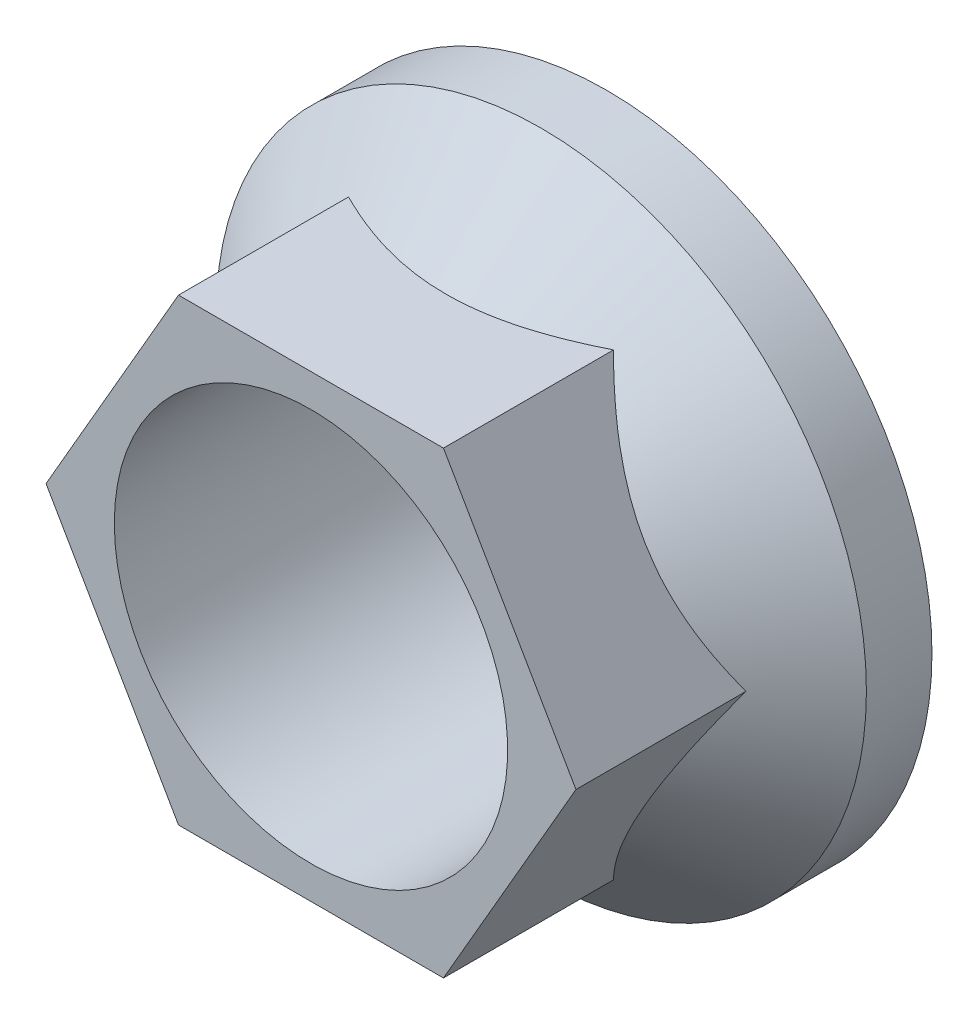
ISO-10303-21;
HEADER;
FILE_DESCRIPTION(('STEP AP214'),'2;1');
FILE_NAME('part.step','',(''),(''),'','','');
FILE_SCHEMA(('AUTOMOTIVE_DESIGN { 1 0 10303 214 1 1 1 1 }'));
ENDSEC;
DATA;
#1=APPLICATION_CONTEXT('core data for automotive mechanical design processes');
#2=APPLICATION_PROTOCOL_DEFINITION('international standard','automotive_design',2000,#1);
#3=PRODUCT_CONTEXT('',#1,'mechanical');
#4=PRODUCT('Part','Part','',(#3));
#5=PRODUCT_RELATED_PRODUCT_CATEGORY('part','',(#4));
#6=PRODUCT_DEFINITION_FORMATION('','',#4);
#7=PRODUCT_DEFINITION_CONTEXT('part definition',#1,'design');
#8=PRODUCT_DEFINITION('design','',#6,#7);
#9=PRODUCT_DEFINITION_SHAPE('','',#8);
#10=(LENGTH_UNIT() NAMED_UNIT(*) SI_UNIT(.MILLI.,.METRE.));
#11=(NAMED_UNIT(*) PLANE_ANGLE_UNIT() SI_UNIT($,.RADIAN.));
#12=(NAMED_UNIT(*) SI_UNIT($,.STERADIAN.) SOLID_ANGLE_UNIT());
#13=UNCERTAINTY_MEASURE_WITH_UNIT(LENGTH_MEASURE(1.E-05),#10,'distance_accuracy_value','');
#14=(GEOMETRIC_REPRESENTATION_CONTEXT(3) GLOBAL_UNCERTAINTY_ASSIGNED_CONTEXT((#13)) GLOBAL_UNIT_ASSIGNED_CONTEXT((#10,
#11,#12)) REPRESENTATION_CONTEXT('',''));
#15=CARTESIAN_POINT('',(0.,0.,0.));
#16=DIRECTION('',(0.,0.,1.));
#17=DIRECTION('',(1.,0.,0.));
#18=AXIS2_PLACEMENT_3D('',#15,#16,#17);
#19=CARTESIAN_POINT('',(0.,4.7625,7.1628));
#20=DIRECTION('',(0.,0.,1.));
#21=DIRECTION('',(1.,0.,0.));
#22=AXIS2_PLACEMENT_3D('',#19,#20,#21);
#23=PLANE('',#22);
#24=CARTESIAN_POINT('',(0.,0.,7.1628));
#25=DIRECTION('',(0.,0.,-1.));
#26=DIRECTION('',(-1.,0.,0.));
#27=AXIS2_PLACEMENT_3D('',#24,#25,#26);
#28=CIRCLE('',#27,4.7625);
#29=CARTESIAN_POINT('',(-4.7625,0.,7.1628));
#30=VERTEX_POINT('',#29);
#31=EDGE_CURVE('E114',#30,#30,#28,.T.);
#32=ORIENTED_EDGE('',*,*,#31,.T.);
#33=EDGE_LOOP('',(#32));
#34=FACE_BOUND('',#33,.T.);
#35=DIRECTION('',(-0.5,0.866025403784439,0.));
#36=VECTOR('',#35,1.);
#37=CARTESIAN_POINT('',(6.41580486636972,0.,7.1628));
#38=LINE('',#37,#36);
#39=CARTESIAN_POINT('',(6.41580486636972,0.,7.1628));
#40=VERTEX_POINT('',#39);
#41=CARTESIAN_POINT('',(3.20790243318486,5.55625,7.1628));
#42=VERTEX_POINT('',#41);
#43=EDGE_CURVE('E99',#40,#42,#38,.T.);
#44=ORIENTED_EDGE('',*,*,#43,.T.);
#45=DIRECTION('',(-1.,0.,0.));
#46=VECTOR('',#45,1.);
#47=CARTESIAN_POINT('',(3.20790243318486,5.55625,7.1628));
#48=LINE('',#47,#46);
#49=CARTESIAN_POINT('',(-3.20790243318486,5.55625,7.1628));
#50=VERTEX_POINT('',#49);
#51=EDGE_CURVE('E95',#42,#50,#48,.T.);
#52=ORIENTED_EDGE('',*,*,#51,.T.);
#53=DIRECTION('',(-0.5,-0.866025403784438,0.));
#54=VECTOR('',#53,1.);
#55=CARTESIAN_POINT('',(-3.20790243318486,5.55625,7.1628));
#56=LINE('',#55,#54);
#57=CARTESIAN_POINT('',(-6.41580486636972,0.,7.1628));
#58=VERTEX_POINT('',#57);
#59=EDGE_CURVE('E85',#50,#58,#56,.T.);
#60=ORIENTED_EDGE('',*,*,#59,.T.);
#61=DIRECTION('',(0.5,-0.866025403784439,0.));
#62=VECTOR('',#61,1.);
#63=CARTESIAN_POINT('',(-6.41580486636972,0.,7.1628));
#64=LINE('',#63,#62);
#65=CARTESIAN_POINT('',(-3.20790243318486,-5.55625,7.1628));
#66=VERTEX_POINT('',#65);
#67=EDGE_CURVE('E94',#58,#66,#64,.T.);
#68=ORIENTED_EDGE('',*,*,#67,.T.);
#69=DIRECTION('',(1.,0.,0.));
#70=VECTOR('',#69,1.);
#71=CARTESIAN_POINT('',(-3.20790243318486,-5.55625,7.1628));
#72=LINE('',#71,#70);
#73=CARTESIAN_POINT('',(3.20790243318486,-5.55625,7.1628));
#74=VERTEX_POINT('',#73);
#75=EDGE_CURVE('E216',#66,#74,#72,.T.);
#76=ORIENTED_EDGE('',*,*,#75,.T.);
#77=DIRECTION('',(0.5,0.866025403784438,0.));
#78=VECTOR('',#77,1.);
#79=CARTESIAN_POINT('',(3.20790243318486,-5.55625,7.1628));
#80=LINE('',#79,#78);
#81=EDGE_CURVE('E110',#74,#40,#80,.T.);
#82=ORIENTED_EDGE('',*,*,#81,.T.);
#83=EDGE_LOOP('',(#44,#52,#60,#68,#76,#82));
#84=FACE_BOUND('',#83,.T.);
#85=ADVANCED_FACE('F34',(#34,#84),#23,.T.);
#86=CARTESIAN_POINT('',(0.,0.,1.5875));
#87=DIRECTION('',(0.,0.,-1.));
#88=DIRECTION('',(-1.,0.,0.));
#89=AXIS2_PLACEMENT_3D('',#86,#87,#88);
#90=CONICAL_SURFACE('',#89,7.874,0.78539816339745);
#91=CARTESIAN_POINT('',(-6.41592033642356,-0.00019999999999813,3.04557966045919));
#92=CARTESIAN_POINT('',(-6.36076227325002,0.0953365678636634,3.1007324220348));
#93=CARTESIAN_POINT('',(-6.30518023730597,0.191607478106875,3.1541926394216));
#94=CARTESIAN_POINT('',(-6.19308504136997,0.385762052752419,3.25721311667275));
#95=CARTESIAN_POINT('',(-6.13657139292006,0.483646563188735,3.30677124652499));
#96=CARTESIAN_POINT('',(-5.96498322925127,0.780845980640526,3.44924281917032));
#97=CARTESIAN_POINT('',(-5.84845612865765,0.982676839327367,3.5353456466525));
#98=CARTESIAN_POINT('',(-5.61346990577191,1.38968491644418,3.68279085611817));
#99=CARTESIAN_POINT('',(-5.49507084527668,1.59475810479033,3.74450470595627));
#100=CARTESIAN_POINT('',(-5.31552571534156,1.90573939208951,3.81589250337743));
#101=CARTESIAN_POINT('',(-5.25541299798502,2.00985767273207,3.83614839260828));
#102=CARTESIAN_POINT('',(-5.13467857755459,2.21897582313996,3.86914080341459));
#103=CARTESIAN_POINT('',(-5.07405695192314,2.32397555877105,3.88187844876181));
#104=CARTESIAN_POINT('',(-4.92633097152755,2.57984446241415,3.90323487487138));
#105=CARTESIAN_POINT('',(-4.83906744920444,2.73098931672518,3.90771592717981));
#106=CARTESIAN_POINT('',(-4.66469767767716,3.03300662031461,3.90019519640634));
#107=CARTESIAN_POINT('',(-4.57759149431931,3.18387895554382,3.88818763540786));
#108=CARTESIAN_POINT('',(-4.40420034365476,3.48420123807766,3.84839747805151));
#109=CARTESIAN_POINT('',(-4.31791640464718,3.63364940431594,3.82059724001052));
#110=CARTESIAN_POINT('',(-4.14683153450048,3.92997709181637,3.75073312732753));
#111=CARTESIAN_POINT('',(-4.06203049017168,4.07685680912875,3.70867034639006));
#112=CARTESIAN_POINT('',(-3.91149236796599,4.337596485265,3.62213363508139));
#113=CARTESIAN_POINT('',(-3.84542197389367,4.45203376467436,3.57993545710749));
#114=CARTESIAN_POINT('',(-3.71446724591897,4.6788540070179,3.48873889719048));
#115=CARTESIAN_POINT('',(-3.64958294807509,4.79123690749694,3.43974030889598));
#116=CARTESIAN_POINT('',(-3.52120477373998,5.01359442802828,3.33604132435941));
#117=CARTESIAN_POINT('',(-3.45770724608012,5.12357537209016,3.28135885880867));
#118=CARTESIAN_POINT('',(-3.33188800845605,5.34150068422464,3.16701006386821));
#119=CARTESIAN_POINT('',(-3.26956560568257,5.44944625227808,3.10734679124864));
#120=CARTESIAN_POINT('',(-3.20778696313102,5.55645,3.04557966045919));
#121=B_SPLINE_CURVE_WITH_KNOTS('',3,(#91,#92,#93,#94,#95,#96,#97,#98,#99,#100,#101,#102,#103,
#104,#105,#106,#107,#108,#109,#110,#111,#112,#113,#114,#115,#116,#117,#118,#119,#120),
.UNSPECIFIED.,.F.,.F.,(4,2,2,2,2,2,2,2,2,2,2,2,2,2,4),(0.,0.369982774103464,0.740166128456626,
1.48452951278213,2.21707291656614,2.58262618134806,2.94812479207227,3.47106468924808,
3.99418788105352,4.51789659566178,5.04156515942817,5.45751515378559,5.8734777724733,
6.28816585755633,6.70260128950947),.UNSPECIFIED.);
#122=CARTESIAN_POINT('',(-6.41580486636972,0.,3.04569513363028));
#123=VERTEX_POINT('',#122);
#124=CARTESIAN_POINT('',(-3.20790243318486,5.55625,3.04569513363028));
#125=VERTEX_POINT('',#124);
#126=EDGE_CURVE('E48',#123,#125,#121,.T.);
#127=ORIENTED_EDGE('',*,*,#126,.T.);
#128=CARTESIAN_POINT('',(-7.35024143807917,5.55625,0.247490923568824));
#129=CARTESIAN_POINT('',(-7.17477848249057,5.55625,0.387431646679454));
#130=CARTESIAN_POINT('',(-6.99844802511035,5.55625,0.526300519665365));
#131=CARTESIAN_POINT('',(-6.6436721673341,5.55625,0.80138477713585));
#132=CARTESIAN_POINT('',(-6.46522633144373,5.55625,0.937599599416392));
#133=CARTESIAN_POINT('',(-6.10455267541776,5.55625,1.2078260776591));
#134=CARTESIAN_POINT('',(-5.92230644932557,5.55625,1.34181324135698));
#135=CARTESIAN_POINT('',(-5.55492580362585,5.55625,1.60575197786215));
#136=CARTESIAN_POINT('',(-5.3697915775665,5.55625,1.73570381937817));
#137=CARTESIAN_POINT('',(-4.98184197050416,5.55625,2.00033263124969));
#138=CARTESIAN_POINT('',(-4.77875522479701,5.55625,2.13461371344198));
#139=CARTESIAN_POINT('',(-4.36779815551963,5.55625,2.39578072044687));
#140=CARTESIAN_POINT('',(-4.15992694071703,5.55625,2.52266525165115));
#141=CARTESIAN_POINT('',(-3.73918743996258,5.55625,2.76641880126752));
#142=CARTESIAN_POINT('',(-3.52633612498972,5.55625,2.88331688555397));
#143=CARTESIAN_POINT('',(-3.09422026463497,5.55625,3.10448218285466));
#144=CARTESIAN_POINT('',(-2.87495904710191,5.55625,3.20875581048902));
#145=CARTESIAN_POINT('',(-2.45872772981492,5.55625,3.38804642128809));
#146=CARTESIAN_POINT('',(-2.26264764911937,5.55625,3.46510898935291));
#147=CARTESIAN_POINT('',(-1.86493159867599,5.55625,3.60358518307688));
#148=CARTESIAN_POINT('',(-1.66329527695573,5.55625,3.66499781481904));
#149=CARTESIAN_POINT('',(-1.25902765194999,5.55625,3.76767534758106));
#150=CARTESIAN_POINT('',(-1.05649142096246,5.55625,3.80930776313862));
#151=CARTESIAN_POINT('',(-0.648160484827875,5.55625,3.87120610965471));
#152=CARTESIAN_POINT('',(-0.442366778371329,5.55625,3.89147846524773));
#153=CARTESIAN_POINT('',(-0.0419810989880809,5.55625,3.9084777691822));
#154=CARTESIAN_POINT('',(0.152554650536229,5.55625,3.90652455263151));
#155=CARTESIAN_POINT('',(0.540351620644994,5.55625,3.88239374529604));
#156=CARTESIAN_POINT('',(0.733612786699872,5.55625,3.86021529481098));
#157=CARTESIAN_POINT('',(1.11857062434674,5.55625,3.79698528703855));
#158=CARTESIAN_POINT('',(1.31024187965122,5.55625,3.75578206043775));
#159=CARTESIAN_POINT('',(1.68928892475082,5.55625,3.65701197831449));
#160=CARTESIAN_POINT('',(1.87666380806737,5.55625,3.59944170327131));
#161=CARTESIAN_POINT('',(2.2415409471002,5.55625,3.47251424021206));
#162=CARTESIAN_POINT('',(2.41917299484202,5.55625,3.40352483236507));
#163=CARTESIAN_POINT('',(2.77004142749089,5.55625,3.25507128648969));
#164=CARTESIAN_POINT('',(2.94327608271936,5.55625,3.17560310058288));
#165=CARTESIAN_POINT('',(3.28583211937289,5.55625,3.00810943147436));
#166=CARTESIAN_POINT('',(3.45514753273432,5.55625,2.92007184015136));
#167=CARTESIAN_POINT('',(3.79000953327712,5.55625,2.73718441291408));
#168=CARTESIAN_POINT('',(3.95555655558467,5.55625,2.64233536880904));
#169=CARTESIAN_POINT('',(4.28552599148123,5.55625,2.44581389895451));
#170=CARTESIAN_POINT('',(4.44990412218786,5.55625,2.34406746743782));
#171=CARTESIAN_POINT('',(4.77570484530172,5.55625,2.13595787120011));
#172=CARTESIAN_POINT('',(4.93712737276281,5.55625,2.02959460520186));
#173=CARTESIAN_POINT('',(5.25725600608033,5.55625,1.81318295888358));
#174=CARTESIAN_POINT('',(5.41596450800714,5.55625,1.70313811284572));
#175=CARTESIAN_POINT('',(5.73115074560433,5.55625,1.47991796361223));
#176=CARTESIAN_POINT('',(5.88762855023672,5.55625,1.36674275751113));
#177=CARTESIAN_POINT('',(6.35842536023995,5.55625,1.02018724732263));
#178=CARTESIAN_POINT('',(6.66976217366638,5.55625,0.782755284416868));
#179=CARTESIAN_POINT('',(7.28649088103237,5.55625,0.300271184655332));
#180=CARTESIAN_POINT('',(7.59188200667029,5.55625,0.0552180734830104));
#181=CARTESIAN_POINT('',(8.19817791335164,5.55625,-0.44060093011009));
#182=CARTESIAN_POINT('',(8.49908090520972,5.55625,-0.691369005131947));
#183=CARTESIAN_POINT('',(9.09728871979774,5.55625,-1.19716338022554));
#184=CARTESIAN_POINT('',(9.39459345614858,5.55625,-1.4521897821736));
#185=CARTESIAN_POINT('',(9.9869246831752,5.55625,-1.96604790998083));
#186=CARTESIAN_POINT('',(10.2819454915805,5.55625,-2.22488617525875));
#187=CARTESIAN_POINT('',(10.8696725901064,5.55625,-2.74517984238541));
#188=CARTESIAN_POINT('',(11.1623788560152,5.55625,-3.00663527154703));
#189=CARTESIAN_POINT('',(11.7458282280203,5.55625,-3.53158245288939));
#190=CARTESIAN_POINT('',(12.0365717971482,5.55625,-3.79507369092072));
#191=CARTESIAN_POINT('',(12.6164957540777,5.55625,-4.32377158515805));
#192=CARTESIAN_POINT('',(12.9056761357909,5.55625,-4.58897824803647));
#193=CARTESIAN_POINT('',(13.7098125421095,5.55625,-5.33007412505525));
#194=CARTESIAN_POINT('',(14.2233438537293,5.55625,-5.80750901835518));
#195=CARTESIAN_POINT('',(15.2473693386069,5.55625,-6.76569063047506));
#196=CARTESIAN_POINT('',(15.7578632962328,5.55625,-7.24643757932181));
#197=CARTESIAN_POINT('',(16.7745943634974,5.55625,-8.20858531475107));
#198=CARTESIAN_POINT('',(17.2808402643804,5.55625,-8.68997681893882));
#199=CARTESIAN_POINT('',(18.2914502713974,5.55625,-9.65464330989552));
#200=CARTESIAN_POINT('',(18.7958145384243,5.55625,-10.1379181280515));
#201=CARTESIAN_POINT('',(19.2995018273049,5.55625,-10.6218932602199));
#202=B_SPLINE_CURVE_WITH_KNOTS('',3,(#128,#129,#130,#131,#132,#133,#134,#135,#136,#137,#138,
#139,#140,#141,#142,#143,#144,#145,#146,#147,#148,#149,#150,#151,#152,#153,#154,#155,#156,#157,
#158,#159,#160,#161,#162,#163,#164,#165,#166,#167,#168,#169,#170,#171,#172,#173,#174,#175,#176,
#177,#178,#179,#180,#181,#182,#183,#184,#185,#186,#187,#188,#189,#190,#191,#192,#193,#194,#195,
#196,#197,#198,#199,#200,#201),.UNSPECIFIED.,.F.,.F.,(4,2,2,2,2,2,2,2,2,2,2,2,2,2,2,2,2,2,2,2,2,
2,2,2,2,2,2,2,2,2,2,2,2,2,2,2,4),(0.,0.673312691722539,1.34676649290897,2.0253196842295,
2.70382759394493,3.43410009403488,4.16450974536377,4.89271543397365,5.62054954672292,
6.25206388705089,6.88361832444262,7.5029290728184,8.12205349297243,8.70461374132282,
9.28719875332011,9.87451064257483,10.4619453275157,11.0332215304045,11.6047190633347,
12.1770361492402,12.7492868125058,13.329152753533,13.9090314212276,14.4883685421543,
15.0676877138596,16.2421214465254,17.4167059455101,18.5917468071523,19.7668158208968,
20.9442134400774,22.121623359487,23.2987450547811,24.4758713314379,26.579399990855,
28.6830762463215,30.7788292080656,32.8743986608165),.UNSPECIFIED.);
#203=CARTESIAN_POINT('',(3.20790243318486,5.55625,3.04569513363027));
#204=VERTEX_POINT('',#203);
#205=EDGE_CURVE('E106',#125,#204,#202,.T.);
#206=ORIENTED_EDGE('',*,*,#205,.T.);
#207=CARTESIAN_POINT('',(3.20778696313102,5.55645,3.04557966045919));
#208=CARTESIAN_POINT('',(3.26294502630456,5.46091343213634,3.1007324220348));
#209=CARTESIAN_POINT('',(3.31852706224861,5.36464252189313,3.1541926394216));
#210=CARTESIAN_POINT('',(3.43062225818461,5.17048794724758,3.25721311667275));
#211=CARTESIAN_POINT('',(3.48713590663451,5.07260343681127,3.30677124652499));
#212=CARTESIAN_POINT('',(3.6587240703033,4.77540401935948,3.44924281917032));
#213=CARTESIAN_POINT('',(3.77525117089692,4.57357316067264,3.5353456466525));
#214=CARTESIAN_POINT('',(4.01023739378267,4.16656508355582,3.68279085611817));
#215=CARTESIAN_POINT('',(4.12863645427789,3.96149189520967,3.74450470595627));
#216=CARTESIAN_POINT('',(4.30818158421301,3.65051060791049,3.81589250337743));
#217=CARTESIAN_POINT('',(4.36829430156956,3.54639232726793,3.83614839260828));
#218=CARTESIAN_POINT('',(4.48902872199999,3.33727417686004,3.86914080341459));
#219=CARTESIAN_POINT('',(4.54965034763144,3.23227444122895,3.8818784487618));
#220=CARTESIAN_POINT('',(4.69737632802703,2.97640553758586,3.90323487487137));
#221=CARTESIAN_POINT('',(4.78463985035014,2.82526068327482,3.9077159271798));
#222=CARTESIAN_POINT('',(4.95900962187742,2.52324337968539,3.90019519640633));
#223=CARTESIAN_POINT('',(5.04611580523527,2.37237104445618,3.88818763540786));
#224=CARTESIAN_POINT('',(5.21950695589982,2.07204876192235,3.84839747805151));
#225=CARTESIAN_POINT('',(5.30579089490739,1.92260059568406,3.82059724001052));
#226=CARTESIAN_POINT('',(5.4768757650541,1.62627290818364,3.75073312732753));
#227=CARTESIAN_POINT('',(5.5616768093829,1.47939319087125,3.70867034639006));
#228=CARTESIAN_POINT('',(5.71221493158858,1.218653514735,3.62213363508139));
#229=CARTESIAN_POINT('',(5.7782853256609,1.10421623532564,3.57993545710749));
#230=CARTESIAN_POINT('',(5.9092400536356,0.8773959929821,3.48873889719048));
#231=CARTESIAN_POINT('',(5.97412435147949,0.765013092503062,3.43974030889598));
#232=CARTESIAN_POINT('',(6.1025025258146,0.542655571971716,3.33604132435941));
#233=CARTESIAN_POINT('',(6.16600005347445,0.43267462790984,3.28135885880867));
#234=CARTESIAN_POINT('',(6.29181929109853,0.214749315775357,3.16701006386821));
#235=CARTESIAN_POINT('',(6.35414169387201,0.106803747721917,3.10734679124864));
#236=CARTESIAN_POINT('',(6.41592033642356,-0.000200000000001221,3.04557966045919));
#237=B_SPLINE_CURVE_WITH_KNOTS('',3,(#207,#208,#209,#210,#211,#212,#213,#214,#215,#216,#217,
#218,#219,#220,#221,#222,#223,#224,#225,#226,#227,#228,#229,#230,#231,#232,#233,#234,#235,#236),
.UNSPECIFIED.,.F.,.F.,(4,2,2,2,2,2,2,2,2,2,2,2,2,2,4),(0.,0.369982774103464,0.740166128456626,
1.48452951278213,2.21707291656614,2.58262618134806,2.94812479207227,3.47106468924808,
3.99418788105352,4.51789659566178,5.04156515942817,5.45751515378559,5.8734777724733,
6.28816585755633,6.70260128950947),.UNSPECIFIED.);
#238=CARTESIAN_POINT('',(6.41580486636972,0.,3.04569513363027));
#239=VERTEX_POINT('',#238);
#240=EDGE_CURVE('E164',#204,#239,#237,.T.);
#241=ORIENTED_EDGE('',*,*,#240,.T.);
#242=CARTESIAN_POINT('',(6.41592033642356,0.00019999999999897,3.04557966045919));
#243=CARTESIAN_POINT('',(6.36076227325002,-0.0953365678636617,3.1007324220348));
#244=CARTESIAN_POINT('',(6.30518023730597,-0.191607478106873,3.1541926394216));
#245=CARTESIAN_POINT('',(6.19308504136997,-0.385762052752417,3.25721311667275));
#246=CARTESIAN_POINT('',(6.13657139292007,-0.483646563188734,3.30677124652499));
#247=CARTESIAN_POINT('',(5.96498322925127,-0.780845980640525,3.44924281917032));
#248=CARTESIAN_POINT('',(5.84845612865765,-0.982676839327365,3.5353456466525));
#249=CARTESIAN_POINT('',(5.61346990577191,-1.38968491644418,3.68279085611817));
#250=CARTESIAN_POINT('',(5.49507084527668,-1.59475810479033,3.74450470595627));
#251=CARTESIAN_POINT('',(5.31552571534156,-1.90573939208951,3.81589250337743));
#252=CARTESIAN_POINT('',(5.25541299798502,-2.00985767273207,3.83614839260828));
#253=CARTESIAN_POINT('',(5.13467857755459,-2.21897582313996,3.86914080341459));
#254=CARTESIAN_POINT('',(5.07405695192314,-2.32397555877105,3.88187844876181));
#255=CARTESIAN_POINT('',(4.92633097152754,-2.57984446241415,3.90323487487138));
#256=CARTESIAN_POINT('',(4.83906744920444,-2.73098931672518,3.90771592717981));
#257=CARTESIAN_POINT('',(4.66469767767716,-3.03300662031462,3.90019519640634));
#258=CARTESIAN_POINT('',(4.5775914943193,-3.18387895554382,3.88818763540786));
#259=CARTESIAN_POINT('',(4.40420034365475,-3.48420123807766,3.84839747805151));
#260=CARTESIAN_POINT('',(4.31791640464718,-3.63364940431594,3.82059724001052));
#261=CARTESIAN_POINT('',(4.14683153450047,-3.92997709181637,3.75073312732753));
#262=CARTESIAN_POINT('',(4.06203049017167,-4.07685680912875,3.70867034639006));
#263=CARTESIAN_POINT('',(3.91149236796599,-4.337596485265,3.62213363508139));
#264=CARTESIAN_POINT('',(3.84542197389367,-4.45203376467436,3.57993545710749));
#265=CARTESIAN_POINT('',(3.71446724591897,-4.6788540070179,3.48873889719048));
#266=CARTESIAN_POINT('',(3.64958294807509,-4.79123690749694,3.43974030889599));
#267=CARTESIAN_POINT('',(3.52120477373998,-5.01359442802828,3.33604132435941));
#268=CARTESIAN_POINT('',(3.45770724608012,-5.12357537209016,3.28135885880867));
#269=CARTESIAN_POINT('',(3.33188800845605,-5.34150068422464,3.16701006386821));
#270=CARTESIAN_POINT('',(3.26956560568257,-5.44944625227808,3.10734679124864));
#271=CARTESIAN_POINT('',(3.20778696313102,-5.55645,3.04557966045919));
#272=B_SPLINE_CURVE_WITH_KNOTS('',3,(#242,#243,#244,#245,#246,#247,#248,#249,#250,#251,#252,
#253,#254,#255,#256,#257,#258,#259,#260,#261,#262,#263,#264,#265,#266,#267,#268,#269,#270,#271),
.UNSPECIFIED.,.F.,.F.,(4,2,2,2,2,2,2,2,2,2,2,2,2,2,4),(0.,0.369982774103464,0.740166128456625,
1.48452951278213,2.21707291656614,2.58262618134806,2.94812479207227,3.47106468924808,
3.99418788105352,4.51789659566178,5.04156515942817,5.45751515378559,5.8734777724733,
6.28816585755633,6.70260128950947),.UNSPECIFIED.);
#273=CARTESIAN_POINT('',(3.20790243318486,-5.55625,3.04569513363028));
#274=VERTEX_POINT('',#273);
#275=EDGE_CURVE('E196',#239,#274,#272,.T.);
#276=ORIENTED_EDGE('',*,*,#275,.T.);
#277=CARTESIAN_POINT('',(-7.35024143807917,-5.55625,0.247490923568823));
#278=CARTESIAN_POINT('',(-7.17477848249057,-5.55625,0.387431646679453));
#279=CARTESIAN_POINT('',(-6.99844802511036,-5.55625,0.526300519665365));
#280=CARTESIAN_POINT('',(-6.6436721673341,-5.55625,0.80138477713585));
#281=CARTESIAN_POINT('',(-6.46522633144373,-5.55625,0.937599599416392));
#282=CARTESIAN_POINT('',(-6.10455267541777,-5.55625,1.2078260776591));
#283=CARTESIAN_POINT('',(-5.92230644932558,-5.55625,1.34181324135698));
#284=CARTESIAN_POINT('',(-5.55492580362585,-5.55625,1.60575197786215));
#285=CARTESIAN_POINT('',(-5.3697915775665,-5.55625,1.73570381937817));
#286=CARTESIAN_POINT('',(-4.98184197050416,-5.55625,2.00033263124969));
#287=CARTESIAN_POINT('',(-4.77875522479701,-5.55625,2.13461371344198));
#288=CARTESIAN_POINT('',(-4.36779815551964,-5.55625,2.39578072044687));
#289=CARTESIAN_POINT('',(-4.15992694071703,-5.55625,2.52266525165115));
#290=CARTESIAN_POINT('',(-3.73918743996259,-5.55625,2.76641880126752));
#291=CARTESIAN_POINT('',(-3.52633612498973,-5.55625,2.88331688555397));
#292=CARTESIAN_POINT('',(-3.09422026463497,-5.55625,3.10448218285466));
#293=CARTESIAN_POINT('',(-2.87495904710191,-5.55625,3.20875581048902));
#294=CARTESIAN_POINT('',(-2.45872772981492,-5.55625,3.38804642128809));
#295=CARTESIAN_POINT('',(-2.26264764911937,-5.55625,3.46510898935291));
#296=CARTESIAN_POINT('',(-1.86493159867599,-5.55625,3.60358518307688));
#297=CARTESIAN_POINT('',(-1.66329527695573,-5.55625,3.66499781481904));
#298=CARTESIAN_POINT('',(-1.25902765195,-5.55625,3.76767534758106));
#299=CARTESIAN_POINT('',(-1.05649142096246,-5.55625,3.80930776313862));
#300=CARTESIAN_POINT('',(-0.648160484827878,-5.55625,3.87120610965471));
#301=CARTESIAN_POINT('',(-0.442366778371332,-5.55625,3.89147846524773));
#302=CARTESIAN_POINT('',(-0.0419810989880835,-5.55625,3.9084777691822));
#303=CARTESIAN_POINT('',(0.152554650536227,-5.55625,3.90652455263152));
#304=CARTESIAN_POINT('',(0.540351620644993,-5.55625,3.88239374529604));
#305=CARTESIAN_POINT('',(0.733612786699871,-5.55625,3.86021529481098));
#306=CARTESIAN_POINT('',(1.11857062434674,-5.55625,3.79698528703855));
#307=CARTESIAN_POINT('',(1.31024187965121,-5.55625,3.75578206043775));
#308=CARTESIAN_POINT('',(1.68928892475082,-5.55625,3.6570119783145));
#309=CARTESIAN_POINT('',(1.87666380806736,-5.55625,3.59944170327131));
#310=CARTESIAN_POINT('',(2.2415409471002,-5.55625,3.47251424021206));
#311=CARTESIAN_POINT('',(2.41917299484202,-5.55625,3.40352483236507));
#312=CARTESIAN_POINT('',(2.77004142749088,-5.55625,3.25507128648969));
#313=CARTESIAN_POINT('',(2.94327608271936,-5.55625,3.17560310058288));
#314=CARTESIAN_POINT('',(3.28583211937289,-5.55625,3.00810943147436));
#315=CARTESIAN_POINT('',(3.45514753273431,-5.55625,2.92007184015136));
#316=CARTESIAN_POINT('',(3.79000953327712,-5.55625,2.73718441291409));
#317=CARTESIAN_POINT('',(3.95555655558467,-5.55625,2.64233536880904));
#318=CARTESIAN_POINT('',(4.28552599148123,-5.55625,2.44581389895451));
#319=CARTESIAN_POINT('',(4.44990412218785,-5.55625,2.34406746743783));
#320=CARTESIAN_POINT('',(4.77570484530172,-5.55625,2.13595787120011));
#321=CARTESIAN_POINT('',(4.9371273727628,-5.55625,2.02959460520187));
#322=CARTESIAN_POINT('',(5.25725600608032,-5.55625,1.81318295888359));
#323=CARTESIAN_POINT('',(5.41596450800714,-5.55625,1.70313811284572));
#324=CARTESIAN_POINT('',(5.73115074560432,-5.55625,1.47991796361223));
#325=CARTESIAN_POINT('',(5.88762855023671,-5.55625,1.36674275751113));
#326=CARTESIAN_POINT('',(6.35842536023994,-5.55625,1.02018724732263));
#327=CARTESIAN_POINT('',(6.66976217366637,-5.55625,0.782755284416872));
#328=CARTESIAN_POINT('',(7.28649088103236,-5.55625,0.300271184655336));
#329=CARTESIAN_POINT('',(7.59188200667029,-5.55625,0.0552180734830148));
#330=CARTESIAN_POINT('',(8.19817791335164,-5.55625,-0.440600930110085));
#331=CARTESIAN_POINT('',(8.49908090520971,-5.55625,-0.691369005131941));
#332=CARTESIAN_POINT('',(9.09728871979773,-5.55625,-1.19716338022553));
#333=CARTESIAN_POINT('',(9.39459345614857,-5.55625,-1.45218978217359));
#334=CARTESIAN_POINT('',(9.98692468317519,-5.55625,-1.96604790998082));
#335=CARTESIAN_POINT('',(10.2819454915805,-5.55625,-2.22488617525874));
#336=CARTESIAN_POINT('',(10.8696725901064,-5.55625,-2.7451798423854));
#337=CARTESIAN_POINT('',(11.1623788560151,-5.55625,-3.00663527154702));
#338=CARTESIAN_POINT('',(11.7458282280203,-5.55625,-3.53158245288938));
#339=CARTESIAN_POINT('',(12.0365717971482,-5.55625,-3.79507369092071));
#340=CARTESIAN_POINT('',(12.6164957540777,-5.55625,-4.32377158515804));
#341=CARTESIAN_POINT('',(12.9056761357909,-5.55625,-4.58897824803646));
#342=CARTESIAN_POINT('',(13.7098125421095,-5.55625,-5.33007412505525));
#343=CARTESIAN_POINT('',(14.2233438537293,-5.55625,-5.80750901835517));
#344=CARTESIAN_POINT('',(15.2473693386069,-5.55625,-6.76569063047506));
#345=CARTESIAN_POINT('',(15.7578632962328,-5.55625,-7.2464375793218));
#346=CARTESIAN_POINT('',(16.7745943634974,-5.55625,-8.20858531475107));
#347=CARTESIAN_POINT('',(17.2808402643804,-5.55625000000001,-8.68997681893882));
#348=CARTESIAN_POINT('',(18.2914502713974,-5.55625000000001,-9.65464330989552));
#349=CARTESIAN_POINT('',(18.7958145384243,-5.55625000000001,-10.1379181280515));
#350=CARTESIAN_POINT('',(19.2995018273049,-5.55625000000001,-10.6218932602199));
#351=B_SPLINE_CURVE_WITH_KNOTS('',3,(#277,#278,#279,#280,#281,#282,#283,#284,#285,#286,#287,
#288,#289,#290,#291,#292,#293,#294,#295,#296,#297,#298,#299,#300,#301,#302,#303,#304,#305,#306,
#307,#308,#309,#310,#311,#312,#313,#314,#315,#316,#317,#318,#319,#320,#321,#322,#323,#324,#325,
#326,#327,#328,#329,#330,#331,#332,#333,#334,#335,#336,#337,#338,#339,#340,#341,#342,#343,#344,
#345,#346,#347,#348,#349,#350),.UNSPECIFIED.,.F.,.F.,(4,2,2,2,2,2,2,2,2,2,2,2,2,2,2,2,2,2,2,2,2,
2,2,2,2,2,2,2,2,2,2,2,2,2,2,2,4),(0.,0.673312691722541,1.34676649290897,2.0253196842295,
2.70382759394493,3.43410009403488,4.16450974536377,4.89271543397364,5.62054954672292,
6.25206388705089,6.88361832444262,7.5029290728184,8.12205349297243,8.70461374132282,
9.28719875332011,9.87451064257483,10.4619453275157,11.0332215304046,11.6047190633347,
12.1770361492402,12.7492868125058,13.329152753533,13.9090314212276,14.4883685421543,
15.0676877138596,16.2421214465254,17.4167059455101,18.5917468071522,19.7668158208968,
20.9442134400774,22.121623359487,23.2987450547811,24.4758713314379,26.579399990855,
28.6830762463215,30.7788292080656,32.8743986608165),.UNSPECIFIED.);
#352=CARTESIAN_POINT('',(-3.20790243318486,-5.55625,3.04569513363028));
#353=VERTEX_POINT('',#352);
#354=EDGE_CURVE('E55',#274,#353,#351,.F.);
#355=ORIENTED_EDGE('',*,*,#354,.T.);
#356=CARTESIAN_POINT('',(-3.20778696313102,-5.55645,3.04557966045919));
#357=CARTESIAN_POINT('',(-3.26294502630456,-5.46091343213634,3.1007324220348));
#358=CARTESIAN_POINT('',(-3.31852706224861,-5.36464252189313,3.1541926394216));
#359=CARTESIAN_POINT('',(-3.43062225818461,-5.17048794724758,3.25721311667275));
#360=CARTESIAN_POINT('',(-3.48713590663451,-5.07260343681127,3.30677124652499));
#361=CARTESIAN_POINT('',(-3.65872407030331,-4.77540401935947,3.44924281917032));
#362=CARTESIAN_POINT('',(-3.77525117089693,-4.57357316067263,3.5353456466525));
#363=CARTESIAN_POINT('',(-4.01023739378267,-4.16656508355582,3.68279085611817));
#364=CARTESIAN_POINT('',(-4.1286364542779,-3.96149189520967,3.74450470595627));
#365=CARTESIAN_POINT('',(-4.30818158421302,-3.65051060791048,3.81589250337743));
#366=CARTESIAN_POINT('',(-4.36829430156956,-3.54639232726793,3.83614839260828));
#367=CARTESIAN_POINT('',(-4.48902872199999,-3.33727417686004,3.86914080341459));
#368=CARTESIAN_POINT('',(-4.54965034763144,-3.23227444122895,3.8818784487618));
#369=CARTESIAN_POINT('',(-4.69737632802704,-2.97640553758585,3.90323487487138));
#370=CARTESIAN_POINT('',(-4.78463985035014,-2.82526068327481,3.90771592717981));
#371=CARTESIAN_POINT('',(-4.95900962187742,-2.52324337968538,3.90019519640633));
#372=CARTESIAN_POINT('',(-5.04611580523527,-2.37237104445617,3.88818763540786));
#373=CARTESIAN_POINT('',(-5.21950695589982,-2.07204876192234,3.8483974780515));
#374=CARTESIAN_POINT('',(-5.3057908949074,-1.92260059568405,3.82059724001052));
#375=CARTESIAN_POINT('',(-5.4768757650541,-1.62627290818363,3.75073312732753));
#376=CARTESIAN_POINT('',(-5.5616768093829,-1.47939319087125,3.70867034639006));
#377=CARTESIAN_POINT('',(-5.71221493158859,-1.21865351473499,3.62213363508139));
#378=CARTESIAN_POINT('',(-5.77828532566091,-1.10421623532563,3.57993545710749));
#379=CARTESIAN_POINT('',(-5.90924005363561,-0.877395992982095,3.48873889719047));
#380=CARTESIAN_POINT('',(-5.97412435147949,-0.765013092503058,3.43974030889598));
#381=CARTESIAN_POINT('',(-6.1025025258146,-0.542655571971713,3.33604132435941));
#382=CARTESIAN_POINT('',(-6.16600005347445,-0.432674627909837,3.28135885880867));
#383=CARTESIAN_POINT('',(-6.29181929109853,-0.214749315775355,3.16701006386821));
#384=CARTESIAN_POINT('',(-6.35414169387201,-0.106803747721915,3.10734679124864));
#385=CARTESIAN_POINT('',(-6.41592033642356,0.000200000000002099,3.04557966045919));
#386=B_SPLINE_CURVE_WITH_KNOTS('',3,(#356,#357,#358,#359,#360,#361,#362,#363,#364,#365,#366,
#367,#368,#369,#370,#371,#372,#373,#374,#375,#376,#377,#378,#379,#380,#381,#382,#383,#384,#385),
.UNSPECIFIED.,.F.,.F.,(4,2,2,2,2,2,2,2,2,2,2,2,2,2,4),(0.,0.369982774103464,0.740166128456625,
1.48452951278213,2.21707291656614,2.58262618134806,2.94812479207227,3.47106468924809,
3.99418788105353,4.51789659566179,5.04156515942818,5.4575151537856,5.8734777724733,
6.28816585755633,6.70260128950947),.UNSPECIFIED.);
#387=EDGE_CURVE('E184',#353,#123,#386,.T.);
#388=ORIENTED_EDGE('',*,*,#387,.T.);
#389=EDGE_LOOP('',(#127,#206,#241,#276,#355,#388));
#390=FACE_BOUND('',#389,.T.);
#391=CARTESIAN_POINT('',(0.,0.,1.5875));
#392=DIRECTION('',(0.,0.,-1.));
#393=DIRECTION('',(-1.,0.,0.));
#394=AXIS2_PLACEMENT_3D('',#391,#392,#393);
#395=CIRCLE('',#394,7.874);
#396=CARTESIAN_POINT('',(-7.874,0.,1.5875));
#397=VERTEX_POINT('',#396);
#398=EDGE_CURVE('E11',#397,#397,#395,.T.);
#399=ORIENTED_EDGE('',*,*,#398,.F.);
#400=EDGE_LOOP('',(#399));
#401=FACE_BOUND('',#400,.T.);
#402=ADVANCED_FACE('F127',(#390,#401),#90,.T.);
#403=CARTESIAN_POINT('',(0.,0.,0.));
#404=DIRECTION('',(0.,0.,-1.));
#405=DIRECTION('',(-1.,0.,0.));
#406=AXIS2_PLACEMENT_3D('',#403,#404,#405);
#407=CYLINDRICAL_SURFACE('',#406,7.874);
#408=ORIENTED_EDGE('',*,*,#398,.T.);
#409=EDGE_LOOP('',(#408));
#410=FACE_BOUND('',#409,.T.);
#411=CARTESIAN_POINT('',(0.,0.,0.));
#412=DIRECTION('',(0.,0.,-1.));
#413=DIRECTION('',(-1.,0.,0.));
#414=AXIS2_PLACEMENT_3D('',#411,#412,#413);
#415=CIRCLE('',#414,7.874);
#416=CARTESIAN_POINT('',(-7.874,0.,0.));
#417=VERTEX_POINT('',#416);
#418=EDGE_CURVE('E41',#417,#417,#415,.T.);
#419=ORIENTED_EDGE('',*,*,#418,.F.);
#420=EDGE_LOOP('',(#419));
#421=FACE_BOUND('',#420,.T.);
#422=ADVANCED_FACE('F125',(#410,#421),#407,.T.);
#423=CARTESIAN_POINT('',(0.,7.874,0.));
#424=DIRECTION('',(0.,0.,-1.));
#425=DIRECTION('',(-1.,0.,0.));
#426=AXIS2_PLACEMENT_3D('',#423,#424,#425);
#427=PLANE('',#426);
#428=ORIENTED_EDGE('',*,*,#418,.T.);
#429=EDGE_LOOP('',(#428));
#430=FACE_BOUND('',#429,.T.);
#431=CARTESIAN_POINT('',(0.,0.,0.));
#432=DIRECTION('',(0.,0.,-1.));
#433=DIRECTION('',(-1.,0.,0.));
#434=AXIS2_PLACEMENT_3D('',#431,#432,#433);
#435=CIRCLE('',#434,4.7625);
#436=CARTESIAN_POINT('',(-4.7625,0.,0.));
#437=VERTEX_POINT('',#436);
#438=EDGE_CURVE('E117',#437,#437,#435,.T.);
#439=ORIENTED_EDGE('',*,*,#438,.F.);
#440=EDGE_LOOP('',(#439));
#441=FACE_BOUND('',#440,.T.);
#442=ADVANCED_FACE('F122',(#430,#441),#427,.T.);
#443=CARTESIAN_POINT('',(0.,0.,0.));
#444=DIRECTION('',(0.,0.,-1.));
#445=DIRECTION('',(-1.,0.,0.));
#446=AXIS2_PLACEMENT_3D('',#443,#444,#445);
#447=CYLINDRICAL_SURFACE('',#446,4.7625);
#448=ORIENTED_EDGE('',*,*,#31,.F.);
#449=EDGE_LOOP('',(#448));
#450=FACE_BOUND('',#449,.T.);
#451=ORIENTED_EDGE('',*,*,#438,.T.);
#452=EDGE_LOOP('',(#451));
#453=FACE_BOUND('',#452,.T.);
#454=ADVANCED_FACE('F134',(#450,#453),#447,.F.);
#455=CARTESIAN_POINT('',(-3.20790243318486,5.55625,-0.00100000000000013));
#456=DIRECTION('',(-0.866025403784438,0.5,0.));
#457=DIRECTION('',(-0.5,-0.866025403784438,0.));
#458=AXIS2_PLACEMENT_3D('',#455,#456,#457);
#459=PLANE('',#458);
#460=ORIENTED_EDGE('',*,*,#59,.F.);
#461=DIRECTION('',(0.,0.,1.));
#462=VECTOR('',#461,1.);
#463=CARTESIAN_POINT('',(-3.20790243318486,5.55625,-0.00100000000000013));
#464=LINE('',#463,#462);
#465=EDGE_CURVE('E89',#125,#50,#464,.T.);
#466=ORIENTED_EDGE('',*,*,#465,.F.);
#467=ORIENTED_EDGE('',*,*,#126,.F.);
#468=DIRECTION('',(0.,0.,1.));
#469=VECTOR('',#468,1.);
#470=CARTESIAN_POINT('',(-6.41580486636972,0.,-0.00100000000000013));
#471=LINE('',#470,#469);
#472=EDGE_CURVE('E91',#123,#58,#471,.T.);
#473=ORIENTED_EDGE('',*,*,#472,.T.);
#474=EDGE_LOOP('',(#460,#466,#467,#473));
#475=FACE_BOUND('',#474,.T.);
#476=ADVANCED_FACE('F87',(#475),#459,.T.);
#477=CARTESIAN_POINT('',(-6.41580486636972,0.,-0.00100000000000013));
#478=DIRECTION('',(-0.866025403784439,-0.5,0.));
#479=DIRECTION('',(0.5,-0.866025403784439,0.));
#480=AXIS2_PLACEMENT_3D('',#477,#478,#479);
#481=PLANE('',#480);
#482=ORIENTED_EDGE('',*,*,#67,.F.);
#483=ORIENTED_EDGE('',*,*,#472,.F.);
#484=ORIENTED_EDGE('',*,*,#387,.F.);
#485=DIRECTION('',(0.,0.,1.));
#486=VECTOR('',#485,1.);
#487=CARTESIAN_POINT('',(-3.20790243318486,-5.55625,-0.00100000000000013));
#488=LINE('',#487,#486);
#489=EDGE_CURVE('E108',#353,#66,#488,.T.);
#490=ORIENTED_EDGE('',*,*,#489,.T.);
#491=EDGE_LOOP('',(#482,#483,#484,#490));
#492=FACE_BOUND('',#491,.T.);
#493=ADVANCED_FACE('F149',(#492),#481,.T.);
#494=CARTESIAN_POINT('',(-3.20790243318486,-5.55625,-0.00100000000000013));
#495=DIRECTION('',(0.,-1.,0.));
#496=DIRECTION('',(1.,0.,0.));
#497=AXIS2_PLACEMENT_3D('',#494,#495,#496);
#498=PLANE('',#497);
#499=ORIENTED_EDGE('',*,*,#75,.F.);
#500=ORIENTED_EDGE('',*,*,#489,.F.);
#501=ORIENTED_EDGE('',*,*,#354,.F.);
#502=DIRECTION('',(0.,0.,1.));
#503=VECTOR('',#502,1.);
#504=CARTESIAN_POINT('',(3.20790243318486,-5.55625,-0.00100000000000013));
#505=LINE('',#504,#503);
#506=EDGE_CURVE('E226',#274,#74,#505,.T.);
#507=ORIENTED_EDGE('',*,*,#506,.T.);
#508=EDGE_LOOP('',(#499,#500,#501,#507));
#509=FACE_BOUND('',#508,.T.);
#510=ADVANCED_FACE('F204',(#509),#498,.T.);
#511=CARTESIAN_POINT('',(3.20790243318486,-5.55625,-0.00100000000000013));
#512=DIRECTION('',(0.866025403784438,-0.5,0.));
#513=DIRECTION('',(0.5,0.866025403784438,0.));
#514=AXIS2_PLACEMENT_3D('',#511,#512,#513);
#515=PLANE('',#514);
#516=DIRECTION('',(0.,0.,1.));
#517=VECTOR('',#516,1.);
#518=CARTESIAN_POINT('',(6.41580486636972,0.,-0.00100000000000013));
#519=LINE('',#518,#517);
#520=EDGE_CURVE('E223',#239,#40,#519,.T.);
#521=ORIENTED_EDGE('',*,*,#520,.T.);
#522=ORIENTED_EDGE('',*,*,#81,.F.);
#523=ORIENTED_EDGE('',*,*,#506,.F.);
#524=ORIENTED_EDGE('',*,*,#275,.F.);
#525=EDGE_LOOP('',(#521,#522,#523,#524));
#526=FACE_BOUND('',#525,.T.);
#527=ADVANCED_FACE('F201',(#526),#515,.T.);
#528=CARTESIAN_POINT('',(6.41580486636972,0.,-0.00100000000000013));
#529=DIRECTION('',(0.866025403784439,0.5,0.));
#530=DIRECTION('',(-0.5,0.866025403784439,0.));
#531=AXIS2_PLACEMENT_3D('',#528,#529,#530);
#532=PLANE('',#531);
#533=ORIENTED_EDGE('',*,*,#43,.F.);
#534=ORIENTED_EDGE('',*,*,#520,.F.);
#535=ORIENTED_EDGE('',*,*,#240,.F.);
#536=DIRECTION('',(0.,0.,1.));
#537=VECTOR('',#536,1.);
#538=CARTESIAN_POINT('',(3.20790243318486,5.55625,-0.00100000000000013));
#539=LINE('',#538,#537);
#540=EDGE_CURVE('E221',#204,#42,#539,.T.);
#541=ORIENTED_EDGE('',*,*,#540,.T.);
#542=EDGE_LOOP('',(#533,#534,#535,#541));
#543=FACE_BOUND('',#542,.T.);
#544=ADVANCED_FACE('F154',(#543),#532,.T.);
#545=CARTESIAN_POINT('',(3.20790243318486,5.55625,-0.00100000000000013));
#546=DIRECTION('',(0.,1.,0.));
#547=DIRECTION('',(0.,0.,1.));
#548=AXIS2_PLACEMENT_3D('',#545,#546,#547);
#549=PLANE('',#548);
#550=ORIENTED_EDGE('',*,*,#51,.F.);
#551=ORIENTED_EDGE('',*,*,#540,.F.);
#552=ORIENTED_EDGE('',*,*,#205,.F.);
#553=ORIENTED_EDGE('',*,*,#465,.T.);
#554=EDGE_LOOP('',(#550,#551,#552,#553));
#555=FACE_BOUND('',#554,.T.);
#556=ADVANCED_FACE('F105',(#555),#549,.T.);
#557=CLOSED_SHELL('',(#85,#402,#422,#442,#454,#476,#493,#510,#527,#544,#556));
#558=MANIFOLD_SOLID_BREP('B2',#557);
#559=ADVANCED_BREP_SHAPE_REPRESENTATION('',(#18,#558),#14);
#560=SHAPE_DEFINITION_REPRESENTATION(#9,#559);
ENDSEC;
END-ISO-10303-21;
